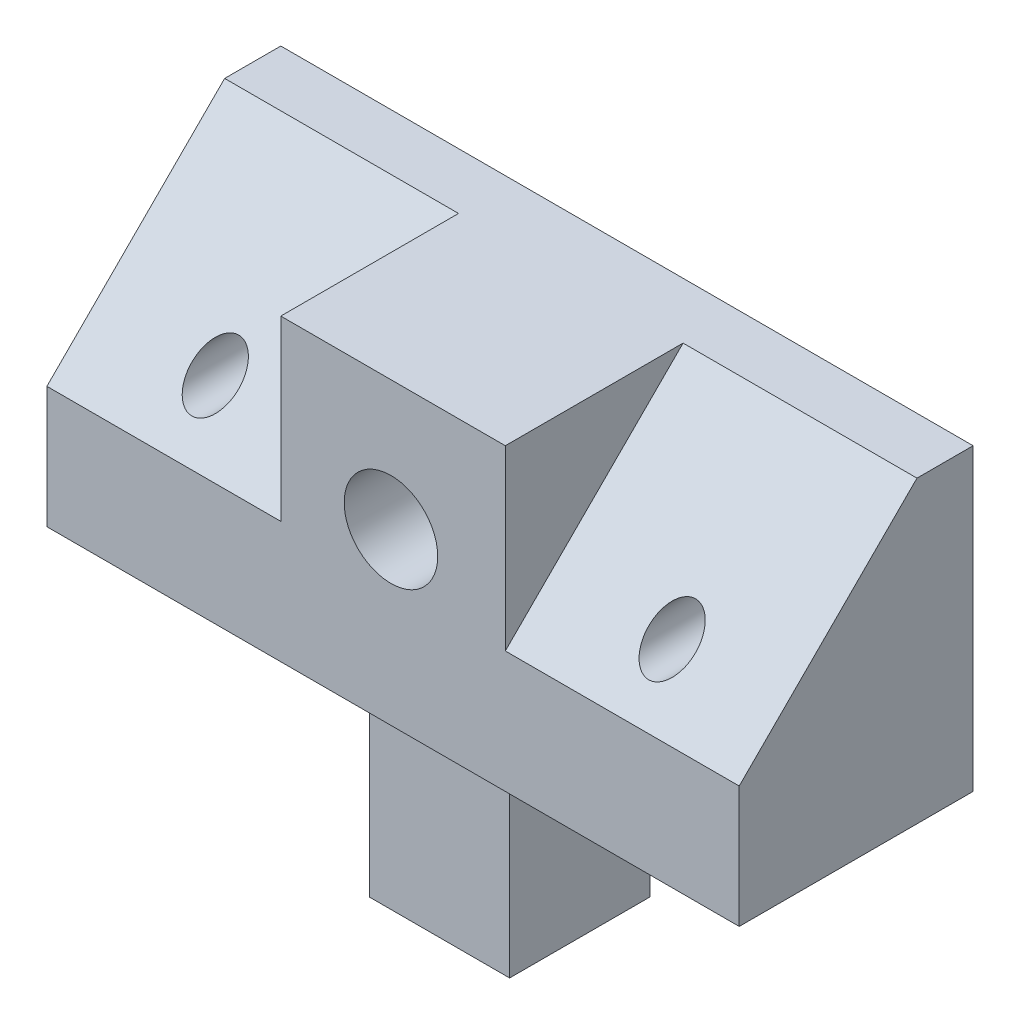
ISO-10303-21;
HEADER;
FILE_DESCRIPTION(('STEP AP214'),'2;1');
FILE_NAME('part.step','',(''),(''),'','','');
FILE_SCHEMA(('AUTOMOTIVE_DESIGN { 1 0 10303 214 1 1 1 1 }'));
ENDSEC;
DATA;
#1=APPLICATION_CONTEXT('core data for automotive mechanical design processes');
#2=APPLICATION_PROTOCOL_DEFINITION('international standard','automotive_design',2000,#1);
#3=PRODUCT_CONTEXT('',#1,'mechanical');
#4=PRODUCT('Part','Part','',(#3));
#5=PRODUCT_RELATED_PRODUCT_CATEGORY('part','',(#4));
#6=PRODUCT_DEFINITION_FORMATION('','',#4);
#7=PRODUCT_DEFINITION_CONTEXT('part definition',#1,'design');
#8=PRODUCT_DEFINITION('design','',#6,#7);
#9=PRODUCT_DEFINITION_SHAPE('','',#8);
#10=(LENGTH_UNIT() NAMED_UNIT(*) SI_UNIT(.MILLI.,.METRE.));
#11=(NAMED_UNIT(*) PLANE_ANGLE_UNIT() SI_UNIT($,.RADIAN.));
#12=(NAMED_UNIT(*) SI_UNIT($,.STERADIAN.) SOLID_ANGLE_UNIT());
#13=UNCERTAINTY_MEASURE_WITH_UNIT(LENGTH_MEASURE(1.E-05),#10,'distance_accuracy_value','');
#14=(GEOMETRIC_REPRESENTATION_CONTEXT(3) GLOBAL_UNCERTAINTY_ASSIGNED_CONTEXT((#13)) GLOBAL_UNIT_ASSIGNED_CONTEXT((#10,
#11,#12)) REPRESENTATION_CONTEXT('',''));
#15=CARTESIAN_POINT('',(0.,0.,0.));
#16=DIRECTION('',(0.,0.,1.));
#17=DIRECTION('',(1.,0.,0.));
#18=AXIS2_PLACEMENT_3D('',#15,#16,#17);
#19=CARTESIAN_POINT('',(0.,0.,25.));
#20=DIRECTION('',(0.,1.,0.));
#21=DIRECTION('',(0.,0.,1.));
#22=AXIS2_PLACEMENT_3D('',#19,#20,#21);
#23=PLANE('',#22);
#24=DIRECTION('',(1.,0.,0.));
#25=VECTOR('',#24,1.);
#26=CARTESIAN_POINT('',(0.,0.,0.));
#27=LINE('',#26,#25);
#28=CARTESIAN_POINT('',(0.,0.,0.));
#29=VERTEX_POINT('',#28);
#30=CARTESIAN_POINT('',(74.,0.,0.));
#31=VERTEX_POINT('',#30);
#32=EDGE_CURVE('E234',#29,#31,#27,.T.);
#33=ORIENTED_EDGE('',*,*,#32,.T.);
#34=DIRECTION('',(0.,0.,-1.));
#35=VECTOR('',#34,1.);
#36=CARTESIAN_POINT('',(74.,0.,25.));
#37=LINE('',#36,#35);
#38=CARTESIAN_POINT('',(74.,0.,25.));
#39=VERTEX_POINT('',#38);
#40=EDGE_CURVE('E49',#39,#31,#37,.T.);
#41=ORIENTED_EDGE('',*,*,#40,.F.);
#42=DIRECTION('',(1.,0.,0.));
#43=VECTOR('',#42,1.);
#44=CARTESIAN_POINT('',(0.,0.,25.));
#45=LINE('',#44,#43);
#46=CARTESIAN_POINT('',(0.,0.,25.));
#47=VERTEX_POINT('',#46);
#48=EDGE_CURVE('E219',#47,#39,#45,.T.);
#49=ORIENTED_EDGE('',*,*,#48,.F.);
#50=DIRECTION('',(0.,0.,-1.));
#51=VECTOR('',#50,1.);
#52=CARTESIAN_POINT('',(0.,0.,25.));
#53=LINE('',#52,#51);
#54=EDGE_CURVE('E11',#47,#29,#53,.T.);
#55=ORIENTED_EDGE('',*,*,#54,.T.);
#56=EDGE_LOOP('',(#33,#41,#49,#55));
#57=FACE_BOUND('',#56,.T.);
#58=DIRECTION('',(0.,0.,1.));
#59=VECTOR('',#58,1.);
#60=CARTESIAN_POINT('',(44.5,0.,5.04139621795886));
#61=LINE('',#60,#59);
#62=CARTESIAN_POINT('',(44.5,0.,5.04139621795886));
#63=VERTEX_POINT('',#62);
#64=CARTESIAN_POINT('',(44.5,0.,20.0413962179589));
#65=VERTEX_POINT('',#64);
#66=EDGE_CURVE('E57',#63,#65,#61,.T.);
#67=ORIENTED_EDGE('',*,*,#66,.F.);
#68=DIRECTION('',(1.,0.,0.));
#69=VECTOR('',#68,1.);
#70=CARTESIAN_POINT('',(29.5,0.,5.04139621795886));
#71=LINE('',#70,#69);
#72=CARTESIAN_POINT('',(29.5,0.,5.04139621795886));
#73=VERTEX_POINT('',#72);
#74=EDGE_CURVE('E61',#73,#63,#71,.T.);
#75=ORIENTED_EDGE('',*,*,#74,.F.);
#76=DIRECTION('',(0.,0.,-1.));
#77=VECTOR('',#76,1.);
#78=CARTESIAN_POINT('',(29.5,0.,5.04139621795886));
#79=LINE('',#78,#77);
#80=CARTESIAN_POINT('',(29.5,0.,20.0413962179589));
#81=VERTEX_POINT('',#80);
#82=EDGE_CURVE('E414',#81,#73,#79,.T.);
#83=ORIENTED_EDGE('',*,*,#82,.F.);
#84=DIRECTION('',(-1.,0.,0.));
#85=VECTOR('',#84,1.);
#86=CARTESIAN_POINT('',(29.5,0.,20.0413962179589));
#87=LINE('',#86,#85);
#88=EDGE_CURVE('E424',#65,#81,#87,.T.);
#89=ORIENTED_EDGE('',*,*,#88,.F.);
#90=EDGE_LOOP('',(#67,#75,#83,#89));
#91=FACE_BOUND('',#90,.T.);
#92=ADVANCED_FACE('F39',(#57,#91),#23,.F.);
#93=CARTESIAN_POINT('',(0.,0.,25.));
#94=DIRECTION('',(1.,0.,0.));
#95=DIRECTION('',(0.,0.,-1.));
#96=AXIS2_PLACEMENT_3D('',#93,#94,#95);
#97=PLANE('',#96);
#98=DIRECTION('',(0.,-1.,0.));
#99=VECTOR('',#98,1.);
#100=CARTESIAN_POINT('',(0.,0.,25.));
#101=LINE('',#100,#99);
#102=CARTESIAN_POINT('',(0.,13.,25.));
#103=VERTEX_POINT('',#102);
#104=EDGE_CURVE('E216',#103,#47,#101,.T.);
#105=ORIENTED_EDGE('',*,*,#104,.F.);
#106=DIRECTION('',(0.,-0.707106781186547,0.707106781186547));
#107=VECTOR('',#106,1.);
#108=CARTESIAN_POINT('',(0.,32.,6.));
#109=LINE('',#108,#107);
#110=CARTESIAN_POINT('',(0.,32.,6.));
#111=VERTEX_POINT('',#110);
#112=EDGE_CURVE('E193',#111,#103,#109,.T.);
#113=ORIENTED_EDGE('',*,*,#112,.F.);
#114=DIRECTION('',(0.,0.,-1.));
#115=VECTOR('',#114,1.);
#116=CARTESIAN_POINT('',(0.,32.,25.));
#117=LINE('',#116,#115);
#118=CARTESIAN_POINT('',(0.,32.,0.));
#119=VERTEX_POINT('',#118);
#120=EDGE_CURVE('E230',#111,#119,#117,.T.);
#121=ORIENTED_EDGE('',*,*,#120,.T.);
#122=DIRECTION('',(0.,-1.,0.));
#123=VECTOR('',#122,1.);
#124=CARTESIAN_POINT('',(0.,0.,0.));
#125=LINE('',#124,#123);
#126=EDGE_CURVE('E213',#119,#29,#125,.T.);
#127=ORIENTED_EDGE('',*,*,#126,.T.);
#128=ORIENTED_EDGE('',*,*,#54,.F.);
#129=EDGE_LOOP('',(#105,#113,#121,#127,#128));
#130=FACE_BOUND('',#129,.T.);
#131=ADVANCED_FACE('F41',(#130),#97,.F.);
#132=CARTESIAN_POINT('',(74.,0.,25.));
#133=DIRECTION('',(-1.,0.,0.));
#134=DIRECTION('',(0.,0.,1.));
#135=AXIS2_PLACEMENT_3D('',#132,#133,#134);
#136=PLANE('',#135);
#137=DIRECTION('',(0.,0.,-1.));
#138=VECTOR('',#137,1.);
#139=CARTESIAN_POINT('',(74.,32.,25.));
#140=LINE('',#139,#138);
#141=CARTESIAN_POINT('',(74.,32.,6.));
#142=VERTEX_POINT('',#141);
#143=CARTESIAN_POINT('',(74.,32.,0.));
#144=VERTEX_POINT('',#143);
#145=EDGE_CURVE('E246',#142,#144,#140,.T.);
#146=ORIENTED_EDGE('',*,*,#145,.F.);
#147=DIRECTION('',(0.,0.707106781186547,-0.707106781186547));
#148=VECTOR('',#147,1.);
#149=CARTESIAN_POINT('',(74.,32.,6.));
#150=LINE('',#149,#148);
#151=CARTESIAN_POINT('',(74.,13.,25.));
#152=VERTEX_POINT('',#151);
#153=EDGE_CURVE('E179',#152,#142,#150,.T.);
#154=ORIENTED_EDGE('',*,*,#153,.F.);
#155=DIRECTION('',(0.,1.,0.));
#156=VECTOR('',#155,1.);
#157=CARTESIAN_POINT('',(74.,0.,25.));
#158=LINE('',#157,#156);
#159=EDGE_CURVE('E223',#39,#152,#158,.T.);
#160=ORIENTED_EDGE('',*,*,#159,.F.);
#161=ORIENTED_EDGE('',*,*,#40,.T.);
#162=DIRECTION('',(0.,1.,0.));
#163=VECTOR('',#162,1.);
#164=CARTESIAN_POINT('',(74.,0.,0.));
#165=LINE('',#164,#163);
#166=EDGE_CURVE('E237',#31,#144,#165,.T.);
#167=ORIENTED_EDGE('',*,*,#166,.T.);
#168=EDGE_LOOP('',(#146,#154,#160,#161,#167));
#169=FACE_BOUND('',#168,.T.);
#170=ADVANCED_FACE('F282',(#169),#136,.F.);
#171=CARTESIAN_POINT('',(0.,32.,25.));
#172=DIRECTION('',(0.,-1.,0.));
#173=DIRECTION('',(0.,0.,-1.));
#174=AXIS2_PLACEMENT_3D('',#171,#172,#173);
#175=PLANE('',#174);
#176=DIRECTION('',(0.,0.,1.));
#177=VECTOR('',#176,1.);
#178=CARTESIAN_POINT('',(49.,32.,25.));
#179=LINE('',#178,#177);
#180=CARTESIAN_POINT('',(49.,32.,6.));
#181=VERTEX_POINT('',#180);
#182=CARTESIAN_POINT('',(49.,32.,25.));
#183=VERTEX_POINT('',#182);
#184=EDGE_CURVE('E183',#181,#183,#179,.T.);
#185=ORIENTED_EDGE('',*,*,#184,.F.);
#186=DIRECTION('',(1.,0.,0.));
#187=VECTOR('',#186,1.);
#188=CARTESIAN_POINT('',(49.,32.,6.));
#189=LINE('',#188,#187);
#190=EDGE_CURVE('E189',#181,#142,#189,.T.);
#191=ORIENTED_EDGE('',*,*,#190,.T.);
#192=ORIENTED_EDGE('',*,*,#145,.T.);
#193=DIRECTION('',(-1.,0.,0.));
#194=VECTOR('',#193,1.);
#195=CARTESIAN_POINT('',(0.,32.,0.));
#196=LINE('',#195,#194);
#197=EDGE_CURVE('E220',#144,#119,#196,.T.);
#198=ORIENTED_EDGE('',*,*,#197,.T.);
#199=ORIENTED_EDGE('',*,*,#120,.F.);
#200=DIRECTION('',(-1.,0.,0.));
#201=VECTOR('',#200,1.);
#202=CARTESIAN_POINT('',(25.,32.,6.));
#203=LINE('',#202,#201);
#204=CARTESIAN_POINT('',(25.,32.,6.));
#205=VERTEX_POINT('',#204);
#206=EDGE_CURVE('E206',#205,#111,#203,.T.);
#207=ORIENTED_EDGE('',*,*,#206,.F.);
#208=DIRECTION('',(0.,0.,-1.));
#209=VECTOR('',#208,1.);
#210=CARTESIAN_POINT('',(25.,32.,25.));
#211=LINE('',#210,#209);
#212=CARTESIAN_POINT('',(25.,32.,25.));
#213=VERTEX_POINT('',#212);
#214=EDGE_CURVE('E200',#213,#205,#211,.T.);
#215=ORIENTED_EDGE('',*,*,#214,.F.);
#216=DIRECTION('',(-1.,0.,0.));
#217=VECTOR('',#216,1.);
#218=CARTESIAN_POINT('',(0.,32.,25.));
#219=LINE('',#218,#217);
#220=EDGE_CURVE('E227',#183,#213,#219,.T.);
#221=ORIENTED_EDGE('',*,*,#220,.F.);
#222=EDGE_LOOP('',(#185,#191,#192,#198,#199,#207,#215,#221));
#223=FACE_BOUND('',#222,.T.);
#224=ADVANCED_FACE('F287',(#223),#175,.F.);
#225=CARTESIAN_POINT('',(0.,0.,25.));
#226=DIRECTION('',(0.,0.,-1.));
#227=DIRECTION('',(-1.,0.,0.));
#228=AXIS2_PLACEMENT_3D('',#225,#226,#227);
#229=PLANE('',#228);
#230=CARTESIAN_POINT('',(36.7751129939333,18.1364265576339,25.));
#231=DIRECTION('',(0.,0.,1.));
#232=DIRECTION('',(1.,0.,0.));
#233=AXIS2_PLACEMENT_3D('',#230,#231,#232);
#234=CIRCLE('',#233,5.);
#235=CARTESIAN_POINT('',(41.7751129939333,18.1364265576339,25.));
#236=VERTEX_POINT('',#235);
#237=EDGE_CURVE('E154',#236,#236,#234,.T.);
#238=ORIENTED_EDGE('',*,*,#237,.F.);
#239=EDGE_LOOP('',(#238));
#240=FACE_BOUND('',#239,.T.);
#241=ORIENTED_EDGE('',*,*,#159,.T.);
#242=DIRECTION('',(1.,0.,0.));
#243=VECTOR('',#242,1.);
#244=CARTESIAN_POINT('',(49.,13.,25.));
#245=LINE('',#244,#243);
#246=CARTESIAN_POINT('',(49.,13.,25.));
#247=VERTEX_POINT('',#246);
#248=EDGE_CURVE('E186',#247,#152,#245,.T.);
#249=ORIENTED_EDGE('',*,*,#248,.F.);
#250=DIRECTION('',(0.,-1.,0.));
#251=VECTOR('',#250,1.);
#252=CARTESIAN_POINT('',(49.,13.,25.));
#253=LINE('',#252,#251);
#254=EDGE_CURVE('E174',#183,#247,#253,.T.);
#255=ORIENTED_EDGE('',*,*,#254,.F.);
#256=ORIENTED_EDGE('',*,*,#220,.T.);
#257=DIRECTION('',(0.,1.,0.));
#258=VECTOR('',#257,1.);
#259=CARTESIAN_POINT('',(25.,32.,25.));
#260=LINE('',#259,#258);
#261=CARTESIAN_POINT('',(25.,13.,25.));
#262=VERTEX_POINT('',#261);
#263=EDGE_CURVE('E196',#262,#213,#260,.T.);
#264=ORIENTED_EDGE('',*,*,#263,.F.);
#265=DIRECTION('',(-1.,0.,0.));
#266=VECTOR('',#265,1.);
#267=CARTESIAN_POINT('',(25.,13.,25.));
#268=LINE('',#267,#266);
#269=EDGE_CURVE('E209',#262,#103,#268,.T.);
#270=ORIENTED_EDGE('',*,*,#269,.T.);
#271=ORIENTED_EDGE('',*,*,#104,.T.);
#272=ORIENTED_EDGE('',*,*,#48,.T.);
#273=EDGE_LOOP('',(#241,#249,#255,#256,#264,#270,#271,#272));
#274=FACE_BOUND('',#273,.T.);
#275=ADVANCED_FACE('F291',(#240,#274),#229,.F.);
#276=CARTESIAN_POINT('',(0.,0.,0.));
#277=DIRECTION('',(0.,0.,-1.));
#278=DIRECTION('',(-1.,0.,0.));
#279=AXIS2_PLACEMENT_3D('',#276,#277,#278);
#280=PLANE('',#279);
#281=CARTESIAN_POINT('',(61.8308120364254,18.,0.));
#282=DIRECTION('',(0.,0.,-1.));
#283=DIRECTION('',(-1.,0.,0.));
#284=AXIS2_PLACEMENT_3D('',#281,#282,#283);
#285=CIRCLE('',#284,2.50000000000001);
#286=CARTESIAN_POINT('',(59.3308120364253,18.,0.));
#287=VERTEX_POINT('',#286);
#288=EDGE_CURVE('E165',#287,#287,#285,.T.);
#289=ORIENTED_EDGE('',*,*,#288,.F.);
#290=EDGE_LOOP('',(#289));
#291=FACE_BOUND('',#290,.T.);
#292=CARTESIAN_POINT('',(13.,18.,0.));
#293=DIRECTION('',(0.,0.,-1.));
#294=DIRECTION('',(-1.,0.,0.));
#295=AXIS2_PLACEMENT_3D('',#292,#293,#294);
#296=CIRCLE('',#295,2.5);
#297=CARTESIAN_POINT('',(10.5,18.,0.));
#298=VERTEX_POINT('',#297);
#299=EDGE_CURVE('E170',#298,#298,#296,.T.);
#300=ORIENTED_EDGE('',*,*,#299,.F.);
#301=EDGE_LOOP('',(#300));
#302=FACE_BOUND('',#301,.T.);
#303=CARTESIAN_POINT('',(36.7751129939333,18.1364265576339,0.));
#304=DIRECTION('',(0.,0.,-1.));
#305=DIRECTION('',(-1.,0.,0.));
#306=AXIS2_PLACEMENT_3D('',#303,#304,#305);
#307=CIRCLE('',#306,5.);
#308=CARTESIAN_POINT('',(31.7751129939333,18.1364265576339,0.));
#309=VERTEX_POINT('',#308);
#310=EDGE_CURVE('E43',#309,#309,#307,.T.);
#311=ORIENTED_EDGE('',*,*,#310,.F.);
#312=EDGE_LOOP('',(#311));
#313=FACE_BOUND('',#312,.T.);
#314=ORIENTED_EDGE('',*,*,#126,.F.);
#315=ORIENTED_EDGE('',*,*,#197,.F.);
#316=ORIENTED_EDGE('',*,*,#166,.F.);
#317=ORIENTED_EDGE('',*,*,#32,.F.);
#318=EDGE_LOOP('',(#314,#315,#316,#317));
#319=FACE_BOUND('',#318,.T.);
#320=ADVANCED_FACE('F293',(#291,#302,#313,#319),#280,.T.);
#321=CARTESIAN_POINT('',(25.,32.,6.));
#322=DIRECTION('',(0.,-0.707106781186547,-0.707106781186547));
#323=DIRECTION('',(0.,0.707106781186548,-0.707106781186548));
#324=AXIS2_PLACEMENT_3D('',#321,#322,#323);
#325=PLANE('',#324);
#326=CARTESIAN_POINT('',(13.,18.,20.));
#327=DIRECTION('',(0.,-0.707106781186547,-0.707106781186547));
#328=DIRECTION('',(0.,-0.707106781186548,0.707106781186548));
#329=AXIS2_PLACEMENT_3D('',#326,#327,#328);
#330=ELLIPSE('',#329,3.53553390593274,2.5);
#331=CARTESIAN_POINT('',(13.,15.5,22.5));
#332=VERTEX_POINT('',#331);
#333=EDGE_CURVE('E169',#332,#332,#330,.T.);
#334=ORIENTED_EDGE('',*,*,#333,.T.);
#335=EDGE_LOOP('',(#334));
#336=FACE_BOUND('',#335,.T.);
#337=ORIENTED_EDGE('',*,*,#112,.T.);
#338=ORIENTED_EDGE('',*,*,#269,.F.);
#339=DIRECTION('',(0.,-0.707106781186547,0.707106781186547));
#340=VECTOR('',#339,1.);
#341=CARTESIAN_POINT('',(25.,32.,6.));
#342=LINE('',#341,#340);
#343=EDGE_CURVE('E203',#205,#262,#342,.T.);
#344=ORIENTED_EDGE('',*,*,#343,.F.);
#345=ORIENTED_EDGE('',*,*,#206,.T.);
#346=EDGE_LOOP('',(#337,#338,#344,#345));
#347=FACE_BOUND('',#346,.T.);
#348=ADVANCED_FACE('F258',(#336,#347),#325,.F.);
#349=CARTESIAN_POINT('',(25.,0.,0.));
#350=DIRECTION('',(1.,0.,0.));
#351=DIRECTION('',(0.,0.,-1.));
#352=AXIS2_PLACEMENT_3D('',#349,#350,#351);
#353=PLANE('',#352);
#354=ORIENTED_EDGE('',*,*,#263,.T.);
#355=ORIENTED_EDGE('',*,*,#214,.T.);
#356=ORIENTED_EDGE('',*,*,#343,.T.);
#357=EDGE_LOOP('',(#354,#355,#356));
#358=FACE_BOUND('',#357,.T.);
#359=ADVANCED_FACE('F302',(#358),#353,.F.);
#360=CARTESIAN_POINT('',(49.,32.,6.));
#361=DIRECTION('',(0.,-0.707106781186547,-0.707106781186547));
#362=DIRECTION('',(0.,0.707106781186548,-0.707106781186548));
#363=AXIS2_PLACEMENT_3D('',#360,#361,#362);
#364=PLANE('',#363);
#365=CARTESIAN_POINT('',(61.8308120364254,18.,20.));
#366=DIRECTION('',(0.,-0.707106781186547,-0.707106781186547));
#367=DIRECTION('',(0.,-0.707106781186548,0.707106781186548));
#368=AXIS2_PLACEMENT_3D('',#365,#366,#367);
#369=ELLIPSE('',#368,3.53553390593275,2.50000000000001);
#370=CARTESIAN_POINT('',(61.8308120364254,15.5,22.5));
#371=VERTEX_POINT('',#370);
#372=EDGE_CURVE('E159',#371,#371,#369,.T.);
#373=ORIENTED_EDGE('',*,*,#372,.T.);
#374=EDGE_LOOP('',(#373));
#375=FACE_BOUND('',#374,.T.);
#376=ORIENTED_EDGE('',*,*,#153,.T.);
#377=ORIENTED_EDGE('',*,*,#190,.F.);
#378=DIRECTION('',(0.,0.707106781186547,-0.707106781186547));
#379=VECTOR('',#378,1.);
#380=CARTESIAN_POINT('',(49.,32.,6.));
#381=LINE('',#380,#379);
#382=EDGE_CURVE('E178',#247,#181,#381,.T.);
#383=ORIENTED_EDGE('',*,*,#382,.F.);
#384=ORIENTED_EDGE('',*,*,#248,.T.);
#385=EDGE_LOOP('',(#376,#377,#383,#384));
#386=FACE_BOUND('',#385,.T.);
#387=ADVANCED_FACE('F305',(#375,#386),#364,.F.);
#388=CARTESIAN_POINT('',(49.,0.,0.));
#389=DIRECTION('',(-1.,0.,0.));
#390=DIRECTION('',(0.,0.,1.));
#391=AXIS2_PLACEMENT_3D('',#388,#389,#390);
#392=PLANE('',#391);
#393=ORIENTED_EDGE('',*,*,#254,.T.);
#394=ORIENTED_EDGE('',*,*,#382,.T.);
#395=ORIENTED_EDGE('',*,*,#184,.T.);
#396=EDGE_LOOP('',(#393,#394,#395));
#397=FACE_BOUND('',#396,.T.);
#398=ADVANCED_FACE('F273',(#397),#392,.F.);
#399=CARTESIAN_POINT('',(61.8308120364254,18.,-8.));
#400=DIRECTION('',(0.,0.,1.));
#401=DIRECTION('',(1.,0.,0.));
#402=AXIS2_PLACEMENT_3D('',#399,#400,#401);
#403=CYLINDRICAL_SURFACE('',#402,2.50000000000001);
#404=ORIENTED_EDGE('',*,*,#288,.T.);
#405=EDGE_LOOP('',(#404));
#406=FACE_BOUND('',#405,.T.);
#407=ORIENTED_EDGE('',*,*,#372,.F.);
#408=EDGE_LOOP('',(#407));
#409=FACE_BOUND('',#408,.T.);
#410=ADVANCED_FACE('F264',(#406,#409),#403,.F.);
#411=CARTESIAN_POINT('',(13.,18.,-8.));
#412=DIRECTION('',(0.,0.,1.));
#413=DIRECTION('',(1.,0.,0.));
#414=AXIS2_PLACEMENT_3D('',#411,#412,#413);
#415=CYLINDRICAL_SURFACE('',#414,2.5);
#416=ORIENTED_EDGE('',*,*,#299,.T.);
#417=EDGE_LOOP('',(#416));
#418=FACE_BOUND('',#417,.T.);
#419=ORIENTED_EDGE('',*,*,#333,.F.);
#420=EDGE_LOOP('',(#419));
#421=FACE_BOUND('',#420,.T.);
#422=ADVANCED_FACE('F261',(#418,#421),#415,.F.);
#423=CARTESIAN_POINT('',(36.7751129939333,18.1364265576339,-8.));
#424=DIRECTION('',(0.,0.,1.));
#425=DIRECTION('',(1.,0.,0.));
#426=AXIS2_PLACEMENT_3D('',#423,#424,#425);
#427=CYLINDRICAL_SURFACE('',#426,5.);
#428=ORIENTED_EDGE('',*,*,#310,.T.);
#429=EDGE_LOOP('',(#428));
#430=FACE_BOUND('',#429,.T.);
#431=ORIENTED_EDGE('',*,*,#237,.T.);
#432=EDGE_LOOP('',(#431));
#433=FACE_BOUND('',#432,.T.);
#434=ADVANCED_FACE('F263',(#430,#433),#427,.F.);
#435=CARTESIAN_POINT('',(44.5,-22.,5.04139621795886));
#436=DIRECTION('',(-1.,0.,0.));
#437=DIRECTION('',(0.,0.,1.));
#438=AXIS2_PLACEMENT_3D('',#435,#436,#437);
#439=PLANE('',#438);
#440=ORIENTED_EDGE('',*,*,#66,.T.);
#441=DIRECTION('',(0.,1.,0.));
#442=VECTOR('',#441,1.);
#443=CARTESIAN_POINT('',(44.5,-22.,20.0413962179589));
#444=LINE('',#443,#442);
#445=CARTESIAN_POINT('',(44.5,-22.,20.0413962179589));
#446=VERTEX_POINT('',#445);
#447=EDGE_CURVE('E134',#446,#65,#444,.T.);
#448=ORIENTED_EDGE('',*,*,#447,.F.);
#449=DIRECTION('',(0.,0.,1.));
#450=VECTOR('',#449,1.);
#451=CARTESIAN_POINT('',(44.5,-22.,5.04139621795886));
#452=LINE('',#451,#450);
#453=CARTESIAN_POINT('',(44.5,-22.,5.04139621795886));
#454=VERTEX_POINT('',#453);
#455=EDGE_CURVE('E141',#454,#446,#452,.T.);
#456=ORIENTED_EDGE('',*,*,#455,.F.);
#457=DIRECTION('',(0.,1.,0.));
#458=VECTOR('',#457,1.);
#459=CARTESIAN_POINT('',(44.5,-22.,5.04139621795886));
#460=LINE('',#459,#458);
#461=EDGE_CURVE('E411',#454,#63,#460,.T.);
#462=ORIENTED_EDGE('',*,*,#461,.T.);
#463=EDGE_LOOP('',(#440,#448,#456,#462));
#464=FACE_BOUND('',#463,.T.);
#465=ADVANCED_FACE('F152',(#464),#439,.F.);
#466=CARTESIAN_POINT('',(29.5,-22.,20.0413962179589));
#467=DIRECTION('',(0.,0.,-1.));
#468=DIRECTION('',(-1.,0.,0.));
#469=AXIS2_PLACEMENT_3D('',#466,#467,#468);
#470=PLANE('',#469);
#471=ORIENTED_EDGE('',*,*,#88,.T.);
#472=DIRECTION('',(0.,1.,0.));
#473=VECTOR('',#472,1.);
#474=CARTESIAN_POINT('',(29.5,-22.,20.0413962179589));
#475=LINE('',#474,#473);
#476=CARTESIAN_POINT('',(29.5,-22.,20.0413962179589));
#477=VERTEX_POINT('',#476);
#478=EDGE_CURVE('E136',#477,#81,#475,.T.);
#479=ORIENTED_EDGE('',*,*,#478,.F.);
#480=DIRECTION('',(-1.,0.,0.));
#481=VECTOR('',#480,1.);
#482=CARTESIAN_POINT('',(29.5,-22.,20.0413962179589));
#483=LINE('',#482,#481);
#484=EDGE_CURVE('E129',#446,#477,#483,.T.);
#485=ORIENTED_EDGE('',*,*,#484,.F.);
#486=ORIENTED_EDGE('',*,*,#447,.T.);
#487=EDGE_LOOP('',(#471,#479,#485,#486));
#488=FACE_BOUND('',#487,.T.);
#489=ADVANCED_FACE('F132',(#488),#470,.F.);
#490=CARTESIAN_POINT('',(29.5,-22.,5.04139621795886));
#491=DIRECTION('',(1.,0.,0.));
#492=DIRECTION('',(0.,0.,-1.));
#493=AXIS2_PLACEMENT_3D('',#490,#491,#492);
#494=PLANE('',#493);
#495=ORIENTED_EDGE('',*,*,#82,.T.);
#496=DIRECTION('',(0.,1.,0.));
#497=VECTOR('',#496,1.);
#498=CARTESIAN_POINT('',(29.5,-22.,5.04139621795886));
#499=LINE('',#498,#497);
#500=CARTESIAN_POINT('',(29.5,-22.,5.04139621795886));
#501=VERTEX_POINT('',#500);
#502=EDGE_CURVE('E161',#501,#73,#499,.T.);
#503=ORIENTED_EDGE('',*,*,#502,.F.);
#504=DIRECTION('',(0.,0.,-1.));
#505=VECTOR('',#504,1.);
#506=CARTESIAN_POINT('',(29.5,-22.,5.04139621795886));
#507=LINE('',#506,#505);
#508=EDGE_CURVE('E140',#477,#501,#507,.T.);
#509=ORIENTED_EDGE('',*,*,#508,.F.);
#510=ORIENTED_EDGE('',*,*,#478,.T.);
#511=EDGE_LOOP('',(#495,#503,#509,#510));
#512=FACE_BOUND('',#511,.T.);
#513=ADVANCED_FACE('F379',(#512),#494,.F.);
#514=CARTESIAN_POINT('',(29.5,-22.,5.04139621795886));
#515=DIRECTION('',(0.,0.,1.));
#516=DIRECTION('',(1.,0.,0.));
#517=AXIS2_PLACEMENT_3D('',#514,#515,#516);
#518=PLANE('',#517);
#519=ORIENTED_EDGE('',*,*,#74,.T.);
#520=ORIENTED_EDGE('',*,*,#461,.F.);
#521=DIRECTION('',(1.,0.,0.));
#522=VECTOR('',#521,1.);
#523=CARTESIAN_POINT('',(29.5,-22.,5.04139621795886));
#524=LINE('',#523,#522);
#525=EDGE_CURVE('E146',#501,#454,#524,.T.);
#526=ORIENTED_EDGE('',*,*,#525,.F.);
#527=ORIENTED_EDGE('',*,*,#502,.T.);
#528=EDGE_LOOP('',(#519,#520,#526,#527));
#529=FACE_BOUND('',#528,.T.);
#530=ADVANCED_FACE('F388',(#529),#518,.F.);
#531=CARTESIAN_POINT('',(0.,-22.,0.));
#532=DIRECTION('',(0.,1.,0.));
#533=DIRECTION('',(0.,0.,1.));
#534=AXIS2_PLACEMENT_3D('',#531,#532,#533);
#535=PLANE('',#534);
#536=ORIENTED_EDGE('',*,*,#455,.T.);
#537=ORIENTED_EDGE('',*,*,#484,.T.);
#538=ORIENTED_EDGE('',*,*,#508,.T.);
#539=ORIENTED_EDGE('',*,*,#525,.T.);
#540=EDGE_LOOP('',(#536,#537,#538,#539));
#541=FACE_BOUND('',#540,.T.);
#542=ADVANCED_FACE('F144',(#541),#535,.F.);
#543=CLOSED_SHELL('',(#92,#131,#170,#224,#275,#320,#348,#359,#387,#398,#410,#422,#434,#465,#489,
#513,#530,#542));
#544=MANIFOLD_SOLID_BREP('B2',#543);
#545=ADVANCED_BREP_SHAPE_REPRESENTATION('',(#18,#544),#14);
#546=SHAPE_DEFINITION_REPRESENTATION(#9,#545);
ENDSEC;
END-ISO-10303-21;
